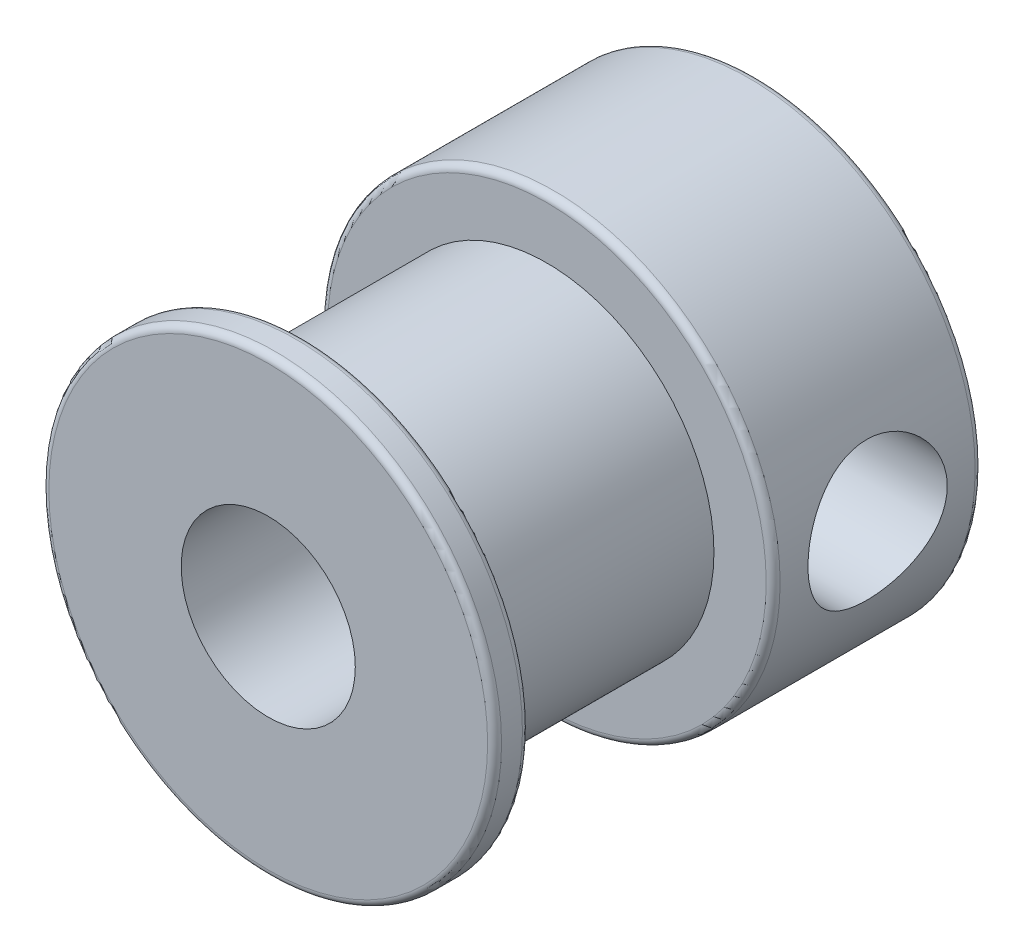
ISO-10303-21;
HEADER;
FILE_DESCRIPTION(('STEP AP214'),'2;1');
FILE_NAME('part.step','',(''),(''),'','','');
FILE_SCHEMA(('AUTOMOTIVE_DESIGN { 1 0 10303 214 1 1 1 1 }'));
ENDSEC;
DATA;
#1=APPLICATION_CONTEXT('core data for automotive mechanical design processes');
#2=APPLICATION_PROTOCOL_DEFINITION('international standard','automotive_design',2000,#1);
#3=PRODUCT_CONTEXT('',#1,'mechanical');
#4=PRODUCT('Part','Part','',(#3));
#5=PRODUCT_RELATED_PRODUCT_CATEGORY('part','',(#4));
#6=PRODUCT_DEFINITION_FORMATION('','',#4);
#7=PRODUCT_DEFINITION_CONTEXT('part definition',#1,'design');
#8=PRODUCT_DEFINITION('design','',#6,#7);
#9=PRODUCT_DEFINITION_SHAPE('','',#8);
#10=(LENGTH_UNIT() NAMED_UNIT(*) SI_UNIT(.MILLI.,.METRE.));
#11=(NAMED_UNIT(*) PLANE_ANGLE_UNIT() SI_UNIT($,.RADIAN.));
#12=(NAMED_UNIT(*) SI_UNIT($,.STERADIAN.) SOLID_ANGLE_UNIT());
#13=UNCERTAINTY_MEASURE_WITH_UNIT(LENGTH_MEASURE(1.E-05),#10,'distance_accuracy_value','');
#14=(GEOMETRIC_REPRESENTATION_CONTEXT(3) GLOBAL_UNCERTAINTY_ASSIGNED_CONTEXT((#13)) GLOBAL_UNIT_ASSIGNED_CONTEXT((#10,
#11,#12)) REPRESENTATION_CONTEXT('',''));
#15=CARTESIAN_POINT('',(0.,0.,0.));
#16=DIRECTION('',(0.,0.,1.));
#17=DIRECTION('',(1.,0.,0.));
#18=AXIS2_PLACEMENT_3D('',#15,#16,#17);
#19=CARTESIAN_POINT('',(0.,0.,14.));
#20=DIRECTION('',(0.,0.,-1.));
#21=DIRECTION('',(-1.,0.,0.));
#22=AXIS2_PLACEMENT_3D('',#19,#20,#21);
#23=CYLINDRICAL_SURFACE('',#22,6.5);
#24=CARTESIAN_POINT('',(0.,0.,13.8));
#25=DIRECTION('',(0.,0.,1.));
#26=DIRECTION('',(1.,0.,0.));
#27=AXIS2_PLACEMENT_3D('',#24,#25,#26);
#28=CIRCLE('',#27,6.5);
#29=CARTESIAN_POINT('',(6.5,0.,13.8));
#30=VERTEX_POINT('',#29);
#31=EDGE_CURVE('E58',#30,#30,#28,.F.);
#32=ORIENTED_EDGE('',*,*,#31,.T.);
#33=EDGE_LOOP('',(#32));
#34=FACE_BOUND('',#33,.T.);
#35=CARTESIAN_POINT('',(0.,0.,13.2));
#36=DIRECTION('',(0.,0.,1.));
#37=DIRECTION('',(1.,0.,0.));
#38=AXIS2_PLACEMENT_3D('',#35,#36,#37);
#39=CIRCLE('',#38,6.5);
#40=CARTESIAN_POINT('',(6.5,0.,13.2));
#41=VERTEX_POINT('',#40);
#42=EDGE_CURVE('E61',#41,#41,#39,.T.);
#43=ORIENTED_EDGE('',*,*,#42,.T.);
#44=EDGE_LOOP('',(#43));
#45=FACE_BOUND('',#44,.T.);
#46=ADVANCED_FACE('F31',(#34,#45),#23,.T.);
#47=CARTESIAN_POINT('',(0.,0.,14.));
#48=DIRECTION('',(0.,0.,1.));
#49=DIRECTION('',(1.,0.,0.));
#50=AXIS2_PLACEMENT_3D('',#47,#48,#49);
#51=PLANE('',#50);
#52=CARTESIAN_POINT('',(0.,0.,14.));
#53=DIRECTION('',(0.,0.,1.));
#54=DIRECTION('',(1.,0.,0.));
#55=AXIS2_PLACEMENT_3D('',#52,#53,#54);
#56=CIRCLE('',#55,6.3);
#57=CARTESIAN_POINT('',(6.3,0.,14.));
#58=VERTEX_POINT('',#57);
#59=EDGE_CURVE('E64',#58,#58,#56,.T.);
#60=ORIENTED_EDGE('',*,*,#59,.T.);
#61=EDGE_LOOP('',(#60));
#62=FACE_BOUND('',#61,.T.);
#63=CARTESIAN_POINT('',(0.,0.,14.));
#64=DIRECTION('',(0.,0.,1.));
#65=DIRECTION('',(1.,0.,0.));
#66=AXIS2_PLACEMENT_3D('',#63,#64,#65);
#67=CIRCLE('',#66,2.5);
#68=CARTESIAN_POINT('',(2.5,0.,14.));
#69=VERTEX_POINT('',#68);
#70=EDGE_CURVE('E67',#69,#69,#67,.T.);
#71=ORIENTED_EDGE('',*,*,#70,.F.);
#72=EDGE_LOOP('',(#71));
#73=FACE_BOUND('',#72,.T.);
#74=ADVANCED_FACE('F110',(#62,#73),#51,.T.);
#75=CARTESIAN_POINT('',(0.,0.,0.));
#76=DIRECTION('',(0.,0.,1.));
#77=DIRECTION('',(1.,0.,0.));
#78=AXIS2_PLACEMENT_3D('',#75,#76,#77);
#79=PLANE('',#78);
#80=CARTESIAN_POINT('',(0.,0.,0.));
#81=DIRECTION('',(0.,0.,1.));
#82=DIRECTION('',(1.,0.,0.));
#83=AXIS2_PLACEMENT_3D('',#80,#81,#82);
#84=CIRCLE('',#83,6.3);
#85=CARTESIAN_POINT('',(6.3,0.,0.));
#86=VERTEX_POINT('',#85);
#87=EDGE_CURVE('E43',#86,#86,#84,.F.);
#88=ORIENTED_EDGE('',*,*,#87,.T.);
#89=EDGE_LOOP('',(#88));
#90=FACE_BOUND('',#89,.T.);
#91=CARTESIAN_POINT('',(0.,0.,0.));
#92=DIRECTION('',(0.,0.,1.));
#93=DIRECTION('',(1.,0.,0.));
#94=AXIS2_PLACEMENT_3D('',#91,#92,#93);
#95=CIRCLE('',#94,2.5);
#96=CARTESIAN_POINT('',(2.5,0.,0.));
#97=VERTEX_POINT('',#96);
#98=EDGE_CURVE('E68',#97,#97,#95,.T.);
#99=ORIENTED_EDGE('',*,*,#98,.T.);
#100=EDGE_LOOP('',(#99));
#101=FACE_BOUND('',#100,.T.);
#102=ADVANCED_FACE('F112',(#90,#101),#79,.F.);
#103=CARTESIAN_POINT('',(6.5,0.,1.));
#104=CARTESIAN_POINT('',(6.49999929187436,-0.10958647155408,1.00000096092096));
#105=CARTESIAN_POINT('',(6.49720235792931,-0.219182761349475,1.00903664760327));
#106=CARTESIAN_POINT('',(6.48631855265072,-0.435175528984373,1.04484941193523));
#107=CARTESIAN_POINT('',(6.47823033671536,-0.541571186300281,1.07163099913251));
#108=CARTESIAN_POINT('',(6.45764858487676,-0.748016546984701,1.14195070689279));
#109=CARTESIAN_POINT('',(6.44516174661237,-0.848075627090343,1.18546336077678));
#110=CARTESIAN_POINT('',(6.4170753591794,-1.03947745536717,1.28790320736724));
#111=CARTESIAN_POINT('',(6.40147534884382,-1.13081890919355,1.34683268423383));
#112=CARTESIAN_POINT('',(6.36829752406617,-1.30493699247679,1.48029767543995));
#113=CARTESIAN_POINT('',(6.35067760587488,-1.38741488565838,1.55521241924312));
#114=CARTESIAN_POINT('',(6.31569252815342,-1.53885708269872,1.71771362350796));
#115=CARTESIAN_POINT('',(6.29832741475793,-1.60781896662595,1.80530234827193));
#116=CARTESIAN_POINT('',(6.26536877845659,-1.73187276184925,1.99322860442736));
#117=CARTESIAN_POINT('',(6.24982736044083,-1.78659481361997,2.09382028929778));
#118=CARTESIAN_POINT('',(6.22290748386974,-1.8782224418158,2.30333396373725));
#119=CARTESIAN_POINT('',(6.21152796681115,-1.91513254914664,2.41225382665439));
#120=CARTESIAN_POINT('',(6.19466009001291,-1.96900160513188,2.63196730605245));
#121=CARTESIAN_POINT('',(6.18900890037713,-1.9865133955599,2.74261253360729));
#122=CARTESIAN_POINT('',(6.1837537050085,-2.00281555895419,2.96540374057241));
#123=CARTESIAN_POINT('',(6.18414814760279,-2.00161073572821,3.0775493275175));
#124=CARTESIAN_POINT('',(6.19079569362891,-1.98094698228321,3.2956150705989));
#125=CARTESIAN_POINT('',(6.19682450731137,-1.96218684702854,3.40160942532222));
#126=CARTESIAN_POINT('',(6.21369772255051,-1.90807645250928,3.60886669659691));
#127=CARTESIAN_POINT('',(6.22454262164885,-1.87272447914839,3.71012912310584));
#128=CARTESIAN_POINT('',(6.2500007072195,-1.78593221700801,3.90673004784501));
#129=CARTESIAN_POINT('',(6.2646654217354,-1.73426970827151,4.00196348562844));
#130=CARTESIAN_POINT('',(6.29608673576222,-1.61647725848254,4.18264054437169));
#131=CARTESIAN_POINT('',(6.31284386417593,-1.55034365635742,4.26808167960593));
#132=CARTESIAN_POINT('',(6.34746551983527,-1.40204114131455,4.43070438833206));
#133=CARTESIAN_POINT('',(6.36534631113152,-1.31929416295853,4.50735628256663));
#134=CARTESIAN_POINT('',(6.39954830533241,-1.14189770882472,4.64582220434313));
#135=CARTESIAN_POINT('',(6.4158693995865,-1.04724740490765,4.7076351986405));
#136=CARTESIAN_POINT('',(6.44527556867774,-0.847732923697558,4.8150129771275));
#137=CARTESIAN_POINT('',(6.45833594999018,-0.74279871896691,4.86045486403883));
#138=CARTESIAN_POINT('',(6.47957102319473,-0.526280934909784,4.93288625395853));
#139=CARTESIAN_POINT('',(6.48774715140185,-0.414699321015768,4.95988118201066));
#140=CARTESIAN_POINT('',(6.49806290071844,-0.192552832432245,4.99375804657509));
#141=CARTESIAN_POINT('',(6.50041772114304,-0.0821071867281257,5.0013573525657));
#142=CARTESIAN_POINT('',(6.49946000316609,0.138491178007731,4.99824523351199));
#143=CARTESIAN_POINT('',(6.49614826472317,0.248643936188296,4.98753639306294));
#144=CARTESIAN_POINT('',(6.48437074848215,0.462785801451478,4.94868951788977));
#145=CARTESIAN_POINT('',(6.47603039774079,0.566859358780054,4.92097535283385));
#146=CARTESIAN_POINT('',(6.45516726536364,0.768852811369359,4.8494189235729));
#147=CARTESIAN_POINT('',(6.44264397218779,0.866771952253667,4.80557468672392));
#148=CARTESIAN_POINT('',(6.41433382910965,1.05627961444668,4.70182880519005));
#149=CARTESIAN_POINT('',(6.39847611273321,1.14766081519562,4.64156832323483));
#150=CARTESIAN_POINT('',(6.36531333623025,1.31925606832412,4.50713316991917));
#151=CARTESIAN_POINT('',(6.34800789569184,1.39946717074091,4.43295483502397));
#152=CARTESIAN_POINT('',(6.31306645909658,1.54963528009096,4.26941670055103));
#153=CARTESIAN_POINT('',(6.29544322340724,1.61908131008095,4.17958392405073));
#154=CARTESIAN_POINT('',(6.2625596331719,1.74195487773042,3.98915666539813));
#155=CARTESIAN_POINT('',(6.24729923089954,1.79538273895787,3.88856240068426));
#156=CARTESIAN_POINT('',(6.22104126828921,1.88435707765313,3.67972174307097));
#157=CARTESIAN_POINT('',(6.21002584634022,1.91997867102389,3.57150973022696));
#158=CARTESIAN_POINT('',(6.19358575896332,1.97237526121825,3.35021738427394));
#159=CARTESIAN_POINT('',(6.18815904950702,1.98915714872108,3.23713884683398));
#160=CARTESIAN_POINT('',(6.18371932373484,2.00291323790433,3.01465192789208));
#161=CARTESIAN_POINT('',(6.18443554393433,2.00072360720728,2.90529999544894));
#162=CARTESIAN_POINT('',(6.19154584982148,1.97860856561739,2.68860216115274));
#163=CARTESIAN_POINT('',(6.19793968557834,1.95868393542585,2.58125617120971));
#164=CARTESIAN_POINT('',(6.21549850608435,1.90221657867545,2.3730625714625));
#165=CARTESIAN_POINT('',(6.22659666514378,1.8659061649831,2.27214589431516));
#166=CARTESIAN_POINT('',(6.25229841004041,1.77788001247773,2.07775644337449));
#167=CARTESIAN_POINT('',(6.26690269287625,1.72616121006624,1.98428515461124));
#168=CARTESIAN_POINT('',(6.29866516433667,1.60648172875982,1.80358749251949));
#169=CARTESIAN_POINT('',(6.31589943241281,1.5379775201733,1.71673450586744));
#170=CARTESIAN_POINT('',(6.35062263668654,1.38763671757875,1.55548593302053));
#171=CARTESIAN_POINT('',(6.36811163907406,1.30579660000223,1.48109364971348));
#172=CARTESIAN_POINT('',(6.40203042414331,1.12802317077525,1.34455082040317));
#173=CARTESIAN_POINT('',(6.41840990638034,1.03172886568531,1.28285642466516));
#174=CARTESIAN_POINT('',(6.44764383058531,0.829631192009798,1.17661554334751));
#175=CARTESIAN_POINT('',(6.46049976109691,0.723831864032402,1.13206181337898));
#176=CARTESIAN_POINT('',(6.48025348346413,0.515929652571418,1.06489928793981));
#177=CARTESIAN_POINT('',(6.48759534805451,0.414403258515526,1.04063052891086));
#178=CARTESIAN_POINT('',(6.49746849091069,0.208587191828518,1.00818194067677));
#179=CARTESIAN_POINT('',(6.50000067395288,0.104298042658335,0.999999085451209));
#180=CARTESIAN_POINT('',(6.5,0.,1.));
#181=B_SPLINE_CURVE_WITH_KNOTS('',3,(#103,#104,#105,#106,#107,#108,#109,#110,#111,#112,#113,
#114,#115,#116,#117,#118,#119,#120,#121,#122,#123,#124,#125,#126,#127,#128,#129,#130,#131,#132,
#133,#134,#135,#136,#137,#138,#139,#140,#141,#142,#143,#144,#145,#146,#147,#148,#149,#150,#151,
#152,#153,#154,#155,#156,#157,#158,#159,#160,#161,#162,#163,#164,#165,#166,#167,#168,#169,#170,
#171,#172,#173,#174,#175,#176,#177,#178,#179,#180),.UNSPECIFIED.,.T.,.F.,(4,2,2,2,2,2,2,2,2,2,2,
2,2,2,2,2,2,2,2,2,2,2,2,2,2,2,2,2,2,2,2,2,2,2,2,2,2,2,4),(0.,0.328376148353204,
0.656835774920463,0.984797413319643,1.31280767013794,1.64969601962051,1.98664463123191,
2.33162619975385,2.67651996741947,3.0113091274622,3.34601236190892,3.66793485951994,
3.98989062214147,4.3164372458817,4.64306657905952,4.98408507994296,5.32512731933627,
5.66867887562647,6.01212935372403,6.34267966649236,6.67318331870836,6.99576592200041,
7.31838798898982,7.6487232534981,7.97914559299321,8.32223487802099,8.6653172321574,
9.00693981167224,9.34843740094787,9.67496275718919,10.0014737403731,10.3234943027839,
10.6455789342452,10.9799294848454,11.3143685200785,11.6592775258489,12.0040405975475,
12.3166287634493,12.6291581207982),.UNSPECIFIED.);
#182=CARTESIAN_POINT('',(6.5,0.,1.));
#183=VERTEX_POINT('',#182);
#184=EDGE_CURVE('E79',#183,#183,#181,.T.);
#185=ORIENTED_EDGE('',*,*,#184,.T.);
#186=EDGE_LOOP('',(#185));
#187=FACE_BOUND('',#186,.T.);
#188=CARTESIAN_POINT('',(0.,0.,0.200000000000001));
#189=DIRECTION('',(0.,0.,1.));
#190=DIRECTION('',(1.,0.,0.));
#191=AXIS2_PLACEMENT_3D('',#188,#189,#190);
#192=CIRCLE('',#191,6.5);
#193=CARTESIAN_POINT('',(6.5,0.,0.200000000000001));
#194=VERTEX_POINT('',#193);
#195=EDGE_CURVE('E47',#194,#194,#192,.T.);
#196=ORIENTED_EDGE('',*,*,#195,.T.);
#197=EDGE_LOOP('',(#196));
#198=FACE_BOUND('',#197,.T.);
#199=CARTESIAN_POINT('',(0.,0.,5.8));
#200=DIRECTION('',(0.,0.,-1.));
#201=DIRECTION('',(-1.,0.,0.));
#202=AXIS2_PLACEMENT_3D('',#199,#200,#201);
#203=CIRCLE('',#202,6.5);
#204=CARTESIAN_POINT('',(-6.5,0.,5.8));
#205=VERTEX_POINT('',#204);
#206=EDGE_CURVE('E52',#205,#205,#203,.T.);
#207=ORIENTED_EDGE('',*,*,#206,.T.);
#208=EDGE_LOOP('',(#207));
#209=FACE_BOUND('',#208,.T.);
#210=ADVANCED_FACE('F84',(#187,#198,#209),#23,.T.);
#211=CARTESIAN_POINT('',(0.,0.,14.));
#212=DIRECTION('',(0.,0.,-1.));
#213=DIRECTION('',(-1.,0.,0.));
#214=AXIS2_PLACEMENT_3D('',#211,#212,#213);
#215=CYLINDRICAL_SURFACE('',#214,2.5);
#216=CARTESIAN_POINT('',(2.5,0.,1.));
#217=CARTESIAN_POINT('',(2.49999264947401,-0.0959968964388696,1.00000757943293));
#218=CARTESIAN_POINT('',(2.49441368411908,-0.192133192964674,1.00696942866356));
#219=CARTESIAN_POINT('',(2.47259269360604,-0.381319365477408,1.03434994004173));
#220=CARTESIAN_POINT('',(2.45632708000382,-0.474361934321336,1.05479837126193));
#221=CARTESIAN_POINT('',(2.4146672181517,-0.654094916824507,1.10767827889507));
#222=CARTESIAN_POINT('',(2.38933120144167,-0.740821698128048,1.14003335143138));
#223=CARTESIAN_POINT('',(2.33136010996601,-0.906926323692544,1.21511734347735));
#224=CARTESIAN_POINT('',(2.29872501207752,-0.986304144671505,1.25784629585059));
#225=CARTESIAN_POINT('',(2.21575664728951,-1.16318123656703,1.36862836503106));
#226=CARTESIAN_POINT('',(2.16321748603216,-1.25736767952115,1.44031891517407));
#227=CARTESIAN_POINT('',(2.05292192603027,-1.43041367827883,1.5972780657395));
#228=CARTESIAN_POINT('',(1.99515072200505,-1.50922761533154,1.68258575350337));
#229=CARTESIAN_POINT('',(1.87856001629835,-1.6521591895554,1.86677398407267));
#230=CARTESIAN_POINT('',(1.81973830902028,-1.71602638457222,1.96584677297612));
#231=CARTESIAN_POINT('',(1.7088210988299,-1.82646834413604,2.17653878250419));
#232=CARTESIAN_POINT('',(1.65670347089169,-1.87310099386401,2.288114333888));
#233=CARTESIAN_POINT('',(1.58835652300928,-1.93086043771819,2.47387895167698));
#234=CARTESIAN_POINT('',(1.56628727770188,-1.94865475820658,2.54381173798029));
#235=CARTESIAN_POINT('',(1.53069889155832,-1.97673396798331,2.68721268412047));
#236=CARTESIAN_POINT('',(1.5171587417974,-1.98703731881776,2.760671673525));
#237=CARTESIAN_POINT('',(1.50084234061103,-1.99939840142554,2.91019251887104));
#238=CARTESIAN_POINT('',(1.49816096926556,-2.00138345613423,2.9862714848208));
#239=CARTESIAN_POINT('',(1.50439962302809,-1.99669481699685,3.13770489203275));
#240=CARTESIAN_POINT('',(1.51332946660241,-1.99001379511087,3.2130586657663));
#241=CARTESIAN_POINT('',(1.5432072129997,-1.9669530271194,3.37222230261273));
#242=CARTESIAN_POINT('',(1.56581842049528,-1.94921808205621,3.455508006054));
#243=CARTESIAN_POINT('',(1.61997459936279,-1.90444547348848,3.61653555953704));
#244=CARTESIAN_POINT('',(1.65154598198641,-1.87738025642251,3.69426015653982));
#245=CARTESIAN_POINT('',(1.73656116159416,-1.79974102194077,3.88066210604098));
#246=CARTESIAN_POINT('',(1.79313372968153,-1.74414886595503,3.98580269830419));
#247=CARTESIAN_POINT('',(1.90913780060687,-1.61638467497537,4.18371667779934));
#248=CARTESIAN_POINT('',(1.96857337048937,-1.54418846902464,4.27647172084354));
#249=CARTESIAN_POINT('',(2.08612751968448,-1.38145818326396,4.45127477140508));
#250=CARTESIAN_POINT('',(2.14416889260779,-1.29048701026967,4.53297192230577));
#251=CARTESIAN_POINT('',(2.25171871494994,-1.09198491072666,4.68009949943431));
#252=CARTESIAN_POINT('',(2.30124991822451,-0.984499645201077,4.74557351611724));
#253=CARTESIAN_POINT('',(2.37424585643318,-0.787777814380558,4.8405628474099));
#254=CARTESIAN_POINT('',(2.40111071224171,-0.702177727329205,4.87500450443907));
#255=CARTESIAN_POINT('',(2.44597564111417,-0.524913923737151,4.93212645098797));
#256=CARTESIAN_POINT('',(2.46398239496913,-0.433254836272283,4.95481560494548));
#257=CARTESIAN_POINT('',(2.48970335685206,-0.245713233844926,4.98713854693579));
#258=CARTESIAN_POINT('',(2.49736378633666,-0.149811307212615,4.99670412474496));
#259=CARTESIAN_POINT('',(2.50148682701864,0.0426080028675196,5.00185904897629));
#260=CARTESIAN_POINT('',(2.49795152409062,0.139125268327964,4.99745099882206));
#261=CARTESIAN_POINT('',(2.48076858642945,0.321746674155464,4.97591718375232));
#262=CARTESIAN_POINT('',(2.46796352405063,0.408060891756567,4.95985082486099));
#263=CARTESIAN_POINT('',(2.43417513213473,0.576335674228722,4.91712781889844));
#264=CARTESIAN_POINT('',(2.41318937553438,0.658294938856942,4.89046802890338));
#265=CARTESIAN_POINT('',(2.36289849431328,0.82123587754891,4.82584962821607));
#266=CARTESIAN_POINT('',(2.33315912736867,0.901843619419055,4.78729421404364));
#267=CARTESIAN_POINT('',(2.26783622722139,1.05541000448331,4.70113784836721));
#268=CARTESIAN_POINT('',(2.23225240258423,1.12836826593788,4.65353644576545));
#269=CARTESIAN_POINT('',(2.14993687522397,1.27925237569143,4.54077568170313));
#270=CARTESIAN_POINT('',(2.1023696976822,1.35550718978129,4.473998309517));
#271=CARTESIAN_POINT('',(2.00443497952019,1.4965368759753,4.33061303862902));
#272=CARTESIAN_POINT('',(1.95405970991097,1.56127777727367,4.25397716316117));
#273=CARTESIAN_POINT('',(1.87374135317135,1.65568487930787,4.12356555676341));
#274=CARTESIAN_POINT('',(1.84354743685463,1.68913741792652,4.07263940924667));
#275=CARTESIAN_POINT('',(1.78435415521131,1.75155001920544,3.96737773857641));
#276=CARTESIAN_POINT('',(1.75535542951891,1.78050769868976,3.91304042811921));
#277=CARTESIAN_POINT('',(1.69983828792997,1.83358089959817,3.80112515971834));
#278=CARTESIAN_POINT('',(1.67331090774834,1.85771431687654,3.74356023275631));
#279=CARTESIAN_POINT('',(1.62410209867689,1.90088481958635,3.62499102149601));
#280=CARTESIAN_POINT('',(1.60141789380427,1.9199255893155,3.56398926248046));
#281=CARTESIAN_POINT('',(1.5601942022258,1.95360165889083,3.4339132757622));
#282=CARTESIAN_POINT('',(1.54209716714775,1.96779559724999,3.36457733505965));
#283=CARTESIAN_POINT('',(1.5149337159379,1.98878905619367,3.22316238726195));
#284=CARTESIAN_POINT('',(1.50584452307525,1.99560723074758,3.15109077954951));
#285=CARTESIAN_POINT('',(1.49824736779721,2.00132058716546,3.00565129453592));
#286=CARTESIAN_POINT('',(1.49979625918437,2.00017319779789,2.93227854584584));
#287=CARTESIAN_POINT('',(1.51330771695992,1.98996519544204,2.7870158069769));
#288=CARTESIAN_POINT('',(1.52528679347387,1.98089203653787,2.7151283526739));
#289=CARTESIAN_POINT('',(1.56207076756083,1.95207745752715,2.55539322565544));
#290=CARTESIAN_POINT('',(1.5894925841937,1.93009230408642,2.46857691750888));
#291=CARTESIAN_POINT('',(1.65288907642407,1.87608177217431,2.30136652131036));
#292=CARTESIAN_POINT('',(1.68888887211293,1.84402681542564,2.22099223996328));
#293=CARTESIAN_POINT('',(1.75491158724438,1.78094746311468,2.08782227795385));
#294=CARTESIAN_POINT('',(1.78388907325008,1.75202363190409,2.03348081848171));
#295=CARTESIAN_POINT('',(1.84307948739002,1.68964733782463,1.92816177018274));
#296=CARTESIAN_POINT('',(1.87329286211509,1.65619322765903,1.87718541504885));
#297=CARTESIAN_POINT('',(1.9643799775812,1.54918435570711,1.72922059670118));
#298=CARTESIAN_POINT('',(2.02569808481402,1.46898541640509,1.63720131333753));
#299=CARTESIAN_POINT('',(2.14418278787112,1.29001718858431,1.46661053516924));
#300=CARTESIAN_POINT('',(2.201284919641,1.19101966157648,1.38822977576321));
#301=CARTESIAN_POINT('',(2.27874650804527,1.02998399899547,1.28442327058321));
#302=CARTESIAN_POINT('',(2.30318868109329,0.974255400199692,1.25213155586488));
#303=CARTESIAN_POINT('',(2.34866115465602,0.858854828628041,1.19263189903861));
#304=CARTESIAN_POINT('',(2.36969354228912,0.79918529980536,1.16542084551549));
#305=CARTESIAN_POINT('',(2.41420905511499,0.655037739424244,1.10821994010439));
#306=CARTESIAN_POINT('',(2.43602892887628,0.569110239590116,1.08051732819907));
#307=CARTESIAN_POINT('',(2.47058864976841,0.392713097427718,1.0368423266123));
#308=CARTESIAN_POINT('',(2.48335227816872,0.302256024103134,1.02083921122541));
#309=CARTESIAN_POINT('',(2.49405378309104,0.175880930919908,1.0074369744397));
#310=CARTESIAN_POINT('',(2.49627918763429,0.14080855282127,1.00465262125423));
#311=CARTESIAN_POINT('',(2.499253810179,0.0704970748918264,1.00093253647254));
#312=CARTESIAN_POINT('',(2.50000269971647,0.0352579397117332,0.999997216210116));
#313=CARTESIAN_POINT('',(2.5,0.,1.));
#314=B_SPLINE_CURVE_WITH_KNOTS('',3,(#216,#217,#218,#219,#220,#221,#222,#223,#224,#225,#226,
#227,#228,#229,#230,#231,#232,#233,#234,#235,#236,#237,#238,#239,#240,#241,#242,#243,#244,#245,
#246,#247,#248,#249,#250,#251,#252,#253,#254,#255,#256,#257,#258,#259,#260,#261,#262,#263,#264,
#265,#266,#267,#268,#269,#270,#271,#272,#273,#274,#275,#276,#277,#278,#279,#280,#281,#282,#283,
#284,#285,#286,#287,#288,#289,#290,#291,#292,#293,#294,#295,#296,#297,#298,#299,#300,#301,#302,
#303,#304,#305,#306,#307,#308,#309,#310,#311,#312,#313),.UNSPECIFIED.,.T.,.F.,(4,2,2,2,2,2,2,2,
2,2,2,2,2,2,2,2,2,2,2,2,2,2,2,2,2,2,2,2,2,2,2,2,2,2,2,2,2,2,2,2,2,2,2,2,2,2,2,2,4),(0.,
0.287836605992209,0.576310692639342,0.862965057250605,1.14962032997081,1.53607888200101,
1.92366738187851,2.31734741765481,2.70969292925127,2.9353448634113,3.16043877408111,
3.38749528500759,3.61474392028823,3.87758630032011,4.14121163495705,4.53425748188301,
4.92787915886674,5.33198173288419,5.73498644040677,6.02213978124802,6.30907621738868,
6.59749843639965,6.88586692268771,7.15087004938159,7.41595185759573,7.69742753051566,
7.9789172435135,8.31365537249325,8.64936529970902,8.85316560745906,9.05707360380851,
9.26021055202079,9.46320013996582,9.68152133432596,9.89928907450684,10.1182215471168,
10.3375012031536,10.616933053181,10.8971934831173,11.1010640012511,11.3050088506911,
11.7129165318148,12.1261363563906,12.3324811048119,12.5386990694968,12.8161540735935,
13.0928777702216,13.1985714874516,13.3042887145431),.UNSPECIFIED.);
#315=CARTESIAN_POINT('',(2.5,0.,1.));
#316=VERTEX_POINT('',#315);
#317=EDGE_CURVE('E35',#316,#316,#314,.T.);
#318=ORIENTED_EDGE('',*,*,#317,.F.);
#319=EDGE_LOOP('',(#318));
#320=FACE_BOUND('',#319,.T.);
#321=ORIENTED_EDGE('',*,*,#70,.T.);
#322=EDGE_LOOP('',(#321));
#323=FACE_BOUND('',#322,.T.);
#324=ORIENTED_EDGE('',*,*,#98,.F.);
#325=EDGE_LOOP('',(#324));
#326=FACE_BOUND('',#325,.T.);
#327=ADVANCED_FACE('F104',(#320,#323,#326),#215,.F.);
#328=CARTESIAN_POINT('',(0.,-9.21608692424266,13.));
#329=DIRECTION('',(0.,0.,1.));
#330=DIRECTION('',(1.,0.,0.));
#331=AXIS2_PLACEMENT_3D('',#328,#329,#330);
#332=PLANE('',#331);
#333=CARTESIAN_POINT('',(0.,0.,13.));
#334=DIRECTION('',(0.,0.,1.));
#335=DIRECTION('',(1.,0.,0.));
#336=AXIS2_PLACEMENT_3D('',#333,#334,#335);
#337=CIRCLE('',#336,6.3);
#338=CARTESIAN_POINT('',(6.3,0.,13.));
#339=VERTEX_POINT('',#338);
#340=EDGE_CURVE('E55',#339,#339,#337,.F.);
#341=ORIENTED_EDGE('',*,*,#340,.T.);
#342=EDGE_LOOP('',(#341));
#343=FACE_BOUND('',#342,.T.);
#344=CARTESIAN_POINT('',(0.,0.,13.));
#345=DIRECTION('',(0.,0.,1.));
#346=DIRECTION('',(1.,0.,0.));
#347=AXIS2_PLACEMENT_3D('',#344,#345,#346);
#348=CIRCLE('',#347,4.8);
#349=CARTESIAN_POINT('',(4.8,0.,13.));
#350=VERTEX_POINT('',#349);
#351=EDGE_CURVE('E71',#350,#350,#348,.T.);
#352=ORIENTED_EDGE('',*,*,#351,.T.);
#353=EDGE_LOOP('',(#352));
#354=FACE_BOUND('',#353,.T.);
#355=ADVANCED_FACE('F98',(#343,#354),#332,.F.);
#356=CARTESIAN_POINT('',(0.,-9.21608692424266,6.));
#357=DIRECTION('',(0.,0.,-1.));
#358=DIRECTION('',(-1.,0.,0.));
#359=AXIS2_PLACEMENT_3D('',#356,#357,#358);
#360=PLANE('',#359);
#361=CARTESIAN_POINT('',(0.,0.,6.));
#362=DIRECTION('',(0.,0.,-1.));
#363=DIRECTION('',(-1.,0.,0.));
#364=AXIS2_PLACEMENT_3D('',#361,#362,#363);
#365=CIRCLE('',#364,6.3);
#366=CARTESIAN_POINT('',(-6.3,0.,6.));
#367=VERTEX_POINT('',#366);
#368=EDGE_CURVE('E10',#367,#367,#365,.F.);
#369=ORIENTED_EDGE('',*,*,#368,.T.);
#370=EDGE_LOOP('',(#369));
#371=FACE_BOUND('',#370,.T.);
#372=CARTESIAN_POINT('',(0.,0.,6.));
#373=DIRECTION('',(0.,0.,1.));
#374=DIRECTION('',(1.,0.,0.));
#375=AXIS2_PLACEMENT_3D('',#372,#373,#374);
#376=CIRCLE('',#375,4.8);
#377=CARTESIAN_POINT('',(4.8,0.,6.));
#378=VERTEX_POINT('',#377);
#379=EDGE_CURVE('E76',#378,#378,#376,.T.);
#380=ORIENTED_EDGE('',*,*,#379,.F.);
#381=EDGE_LOOP('',(#380));
#382=FACE_BOUND('',#381,.T.);
#383=ADVANCED_FACE('F93',(#371,#382),#360,.F.);
#384=CARTESIAN_POINT('',(0.,0.,15.643909913923));
#385=DIRECTION('',(0.,0.,1.));
#386=DIRECTION('',(1.,0.,0.));
#387=AXIS2_PLACEMENT_3D('',#384,#385,#386);
#388=CYLINDRICAL_SURFACE('',#387,4.8);
#389=ORIENTED_EDGE('',*,*,#351,.F.);
#390=EDGE_LOOP('',(#389));
#391=FACE_BOUND('',#390,.T.);
#392=ORIENTED_EDGE('',*,*,#379,.T.);
#393=EDGE_LOOP('',(#392));
#394=FACE_BOUND('',#393,.T.);
#395=ADVANCED_FACE('F97',(#391,#394),#388,.T.);
#396=CARTESIAN_POINT('',(0.,0.,13.8));
#397=DIRECTION('',(0.,0.,1.));
#398=DIRECTION('',(1.,0.,0.));
#399=AXIS2_PLACEMENT_3D('',#396,#397,#398);
#400=TOROIDAL_SURFACE('',#399,6.3,0.2);
#401=ORIENTED_EDGE('',*,*,#31,.F.);
#402=EDGE_LOOP('',(#401));
#403=FACE_BOUND('',#402,.T.);
#404=ORIENTED_EDGE('',*,*,#59,.F.);
#405=EDGE_LOOP('',(#404));
#406=FACE_BOUND('',#405,.T.);
#407=ADVANCED_FACE('F101',(#403,#406),#400,.T.);
#408=CARTESIAN_POINT('',(0.,0.,13.2));
#409=DIRECTION('',(0.,0.,1.));
#410=DIRECTION('',(1.,0.,0.));
#411=AXIS2_PLACEMENT_3D('',#408,#409,#410);
#412=TOROIDAL_SURFACE('',#411,6.3,0.2);
#413=ORIENTED_EDGE('',*,*,#340,.F.);
#414=EDGE_LOOP('',(#413));
#415=FACE_BOUND('',#414,.T.);
#416=ORIENTED_EDGE('',*,*,#42,.F.);
#417=EDGE_LOOP('',(#416));
#418=FACE_BOUND('',#417,.T.);
#419=ADVANCED_FACE('F130',(#415,#418),#412,.T.);
#420=CARTESIAN_POINT('',(0.,0.,0.200000000000001));
#421=DIRECTION('',(0.,0.,1.));
#422=DIRECTION('',(1.,0.,0.));
#423=AXIS2_PLACEMENT_3D('',#420,#421,#422);
#424=TOROIDAL_SURFACE('',#423,6.3,0.2);
#425=ORIENTED_EDGE('',*,*,#87,.F.);
#426=EDGE_LOOP('',(#425));
#427=FACE_BOUND('',#426,.T.);
#428=ORIENTED_EDGE('',*,*,#195,.F.);
#429=EDGE_LOOP('',(#428));
#430=FACE_BOUND('',#429,.T.);
#431=ADVANCED_FACE('F132',(#427,#430),#424,.T.);
#432=CARTESIAN_POINT('',(0.,0.,5.8));
#433=DIRECTION('',(0.,0.,-1.));
#434=DIRECTION('',(-1.,0.,0.));
#435=AXIS2_PLACEMENT_3D('',#432,#433,#434);
#436=TOROIDAL_SURFACE('',#435,6.3,0.2);
#437=ORIENTED_EDGE('',*,*,#368,.F.);
#438=EDGE_LOOP('',(#437));
#439=FACE_BOUND('',#438,.T.);
#440=ORIENTED_EDGE('',*,*,#206,.F.);
#441=EDGE_LOOP('',(#440));
#442=FACE_BOUND('',#441,.T.);
#443=ADVANCED_FACE('F33',(#439,#442),#436,.T.);
#444=CARTESIAN_POINT('',(0.499999999999999,0.,3.));
#445=DIRECTION('',(1.,0.,0.));
#446=DIRECTION('',(0.,0.,-1.));
#447=AXIS2_PLACEMENT_3D('',#444,#445,#446);
#448=CYLINDRICAL_SURFACE('',#447,2.);
#449=ORIENTED_EDGE('',*,*,#317,.T.);
#450=EDGE_LOOP('',(#449));
#451=FACE_BOUND('',#450,.T.);
#452=ORIENTED_EDGE('',*,*,#184,.F.);
#453=EDGE_LOOP('',(#452));
#454=FACE_BOUND('',#453,.T.);
#455=ADVANCED_FACE('F88',(#451,#454),#448,.F.);
#456=CLOSED_SHELL('',(#46,#74,#102,#210,#327,#355,#383,#395,#407,#419,#431,#443,#455));
#457=MANIFOLD_SOLID_BREP('B2',#456);
#458=ADVANCED_BREP_SHAPE_REPRESENTATION('',(#18,#457),#14);
#459=SHAPE_DEFINITION_REPRESENTATION(#9,#458);
ENDSEC;
END-ISO-10303-21;
